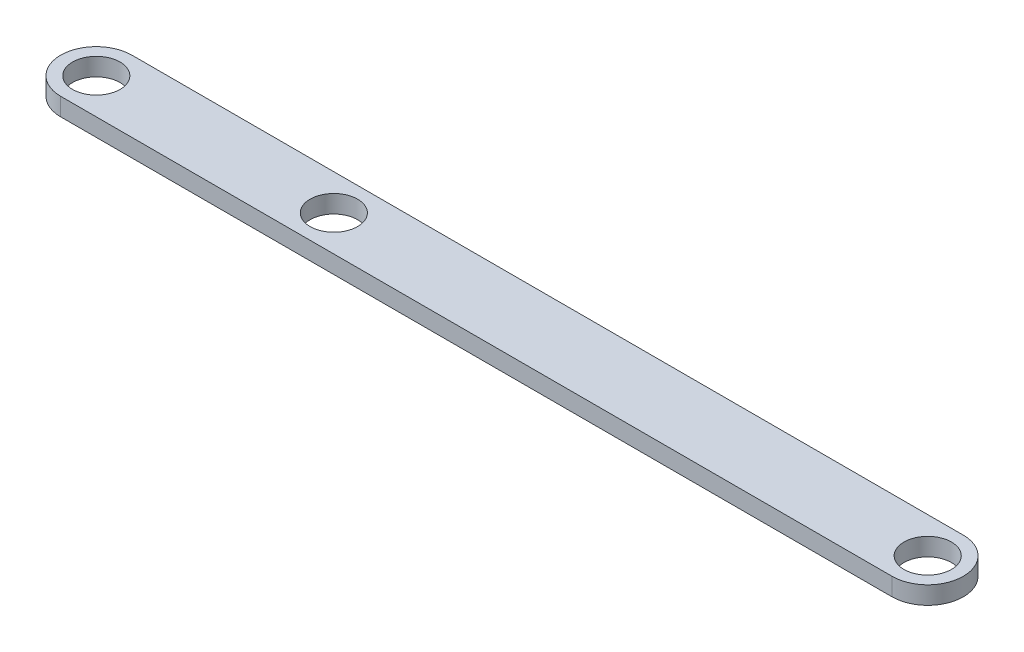
ISO-10303-21;
HEADER;
FILE_DESCRIPTION(('STEP AP214'),'2;1');
FILE_NAME('part.step','',(''),(''),'','','');
FILE_SCHEMA(('AUTOMOTIVE_DESIGN { 1 0 10303 214 1 1 1 1 }'));
ENDSEC;
DATA;
#1=APPLICATION_CONTEXT('core data for automotive mechanical design processes');
#2=APPLICATION_PROTOCOL_DEFINITION('international standard','automotive_design',2000,#1);
#3=PRODUCT_CONTEXT('',#1,'mechanical');
#4=PRODUCT('Part','Part','',(#3));
#5=PRODUCT_RELATED_PRODUCT_CATEGORY('part','',(#4));
#6=PRODUCT_DEFINITION_FORMATION('','',#4);
#7=PRODUCT_DEFINITION_CONTEXT('part definition',#1,'design');
#8=PRODUCT_DEFINITION('design','',#6,#7);
#9=PRODUCT_DEFINITION_SHAPE('','',#8);
#10=(LENGTH_UNIT() NAMED_UNIT(*) SI_UNIT(.MILLI.,.METRE.));
#11=(NAMED_UNIT(*) PLANE_ANGLE_UNIT() SI_UNIT($,.RADIAN.));
#12=(NAMED_UNIT(*) SI_UNIT($,.STERADIAN.) SOLID_ANGLE_UNIT());
#13=UNCERTAINTY_MEASURE_WITH_UNIT(LENGTH_MEASURE(1.E-05),#10,'distance_accuracy_value','');
#14=(GEOMETRIC_REPRESENTATION_CONTEXT(3) GLOBAL_UNCERTAINTY_ASSIGNED_CONTEXT((#13)) GLOBAL_UNIT_ASSIGNED_CONTEXT((#10,
#11,#12)) REPRESENTATION_CONTEXT('',''));
#15=CARTESIAN_POINT('',(0.,0.,0.));
#16=DIRECTION('',(0.,0.,1.));
#17=DIRECTION('',(1.,0.,0.));
#18=AXIS2_PLACEMENT_3D('',#15,#16,#17);
#19=CARTESIAN_POINT('',(0.,3.,0.));
#20=DIRECTION('',(0.,1.,0.));
#21=DIRECTION('',(0.,0.,1.));
#22=AXIS2_PLACEMENT_3D('',#19,#20,#21);
#23=PLANE('',#22);
#24=CARTESIAN_POINT('',(40.,3.,0.));
#25=DIRECTION('',(0.,1.,0.));
#26=DIRECTION('',(0.,0.,1.));
#27=AXIS2_PLACEMENT_3D('',#24,#25,#26);
#28=CIRCLE('',#27,4.);
#29=CARTESIAN_POINT('',(40.,3.,4.));
#30=VERTEX_POINT('',#29);
#31=EDGE_CURVE('E128',#30,#30,#28,.T.);
#32=ORIENTED_EDGE('',*,*,#31,.F.);
#33=EDGE_LOOP('',(#32));
#34=FACE_BOUND('',#33,.T.);
#35=CARTESIAN_POINT('',(0.,3.,0.));
#36=DIRECTION('',(0.,1.,0.));
#37=DIRECTION('',(0.,0.,1.));
#38=AXIS2_PLACEMENT_3D('',#35,#36,#37);
#39=CIRCLE('',#38,4.);
#40=CARTESIAN_POINT('',(0.,3.,4.));
#41=VERTEX_POINT('',#40);
#42=EDGE_CURVE('E104',#41,#41,#39,.T.);
#43=ORIENTED_EDGE('',*,*,#42,.F.);
#44=EDGE_LOOP('',(#43));
#45=FACE_BOUND('',#44,.T.);
#46=CARTESIAN_POINT('',(0.,3.,0.));
#47=DIRECTION('',(0.,1.,0.));
#48=DIRECTION('',(0.,0.,1.));
#49=AXIS2_PLACEMENT_3D('',#46,#47,#48);
#50=CIRCLE('',#49,6.);
#51=CARTESIAN_POINT('',(0.,3.,-6.));
#52=VERTEX_POINT('',#51);
#53=CARTESIAN_POINT('',(0.,3.,6.));
#54=VERTEX_POINT('',#53);
#55=EDGE_CURVE('E89',#52,#54,#50,.T.);
#56=ORIENTED_EDGE('',*,*,#55,.T.);
#57=DIRECTION('',(1.,0.,0.));
#58=VECTOR('',#57,1.);
#59=CARTESIAN_POINT('',(0.,3.,6.));
#60=LINE('',#59,#58);
#61=CARTESIAN_POINT('',(140.,3.,6.));
#62=VERTEX_POINT('',#61);
#63=EDGE_CURVE('E84',#54,#62,#60,.T.);
#64=ORIENTED_EDGE('',*,*,#63,.T.);
#65=CARTESIAN_POINT('',(140.,3.,0.));
#66=DIRECTION('',(0.,1.,0.));
#67=DIRECTION('',(0.,0.,1.));
#68=AXIS2_PLACEMENT_3D('',#65,#66,#67);
#69=CIRCLE('',#68,6.);
#70=CARTESIAN_POINT('',(140.,3.,-6.));
#71=VERTEX_POINT('',#70);
#72=EDGE_CURVE('E87',#62,#71,#69,.T.);
#73=ORIENTED_EDGE('',*,*,#72,.T.);
#74=DIRECTION('',(-1.,0.,0.));
#75=VECTOR('',#74,1.);
#76=CARTESIAN_POINT('',(0.,3.,-6.));
#77=LINE('',#76,#75);
#78=EDGE_CURVE('E54',#71,#52,#77,.T.);
#79=ORIENTED_EDGE('',*,*,#78,.T.);
#80=EDGE_LOOP('',(#56,#64,#73,#79));
#81=FACE_BOUND('',#80,.T.);
#82=CARTESIAN_POINT('',(140.,3.,0.));
#83=DIRECTION('',(0.,1.,0.));
#84=DIRECTION('',(0.,0.,1.));
#85=AXIS2_PLACEMENT_3D('',#82,#83,#84);
#86=CIRCLE('',#85,3.99999999999999);
#87=CARTESIAN_POINT('',(140.,3.,3.99999999999999));
#88=VERTEX_POINT('',#87);
#89=EDGE_CURVE('E119',#88,#88,#86,.T.);
#90=ORIENTED_EDGE('',*,*,#89,.F.);
#91=EDGE_LOOP('',(#90));
#92=FACE_BOUND('',#91,.T.);
#93=ADVANCED_FACE('F37',(#34,#45,#81,#92),#23,.T.);
#94=CARTESIAN_POINT('',(0.,0.,0.));
#95=DIRECTION('',(0.,1.,0.));
#96=DIRECTION('',(0.,0.,1.));
#97=AXIS2_PLACEMENT_3D('',#94,#95,#96);
#98=PLANE('',#97);
#99=CARTESIAN_POINT('',(40.,0.,0.));
#100=DIRECTION('',(0.,1.,0.));
#101=DIRECTION('',(0.,0.,1.));
#102=AXIS2_PLACEMENT_3D('',#99,#100,#101);
#103=CIRCLE('',#102,4.);
#104=CARTESIAN_POINT('',(40.,0.,4.));
#105=VERTEX_POINT('',#104);
#106=EDGE_CURVE('E125',#105,#105,#103,.T.);
#107=ORIENTED_EDGE('',*,*,#106,.T.);
#108=EDGE_LOOP('',(#107));
#109=FACE_BOUND('',#108,.T.);
#110=CARTESIAN_POINT('',(0.,0.,0.));
#111=DIRECTION('',(0.,1.,0.));
#112=DIRECTION('',(0.,0.,1.));
#113=AXIS2_PLACEMENT_3D('',#110,#111,#112);
#114=CIRCLE('',#113,6.);
#115=CARTESIAN_POINT('',(0.,0.,-6.));
#116=VERTEX_POINT('',#115);
#117=CARTESIAN_POINT('',(0.,0.,6.));
#118=VERTEX_POINT('',#117);
#119=EDGE_CURVE('E101',#116,#118,#114,.T.);
#120=ORIENTED_EDGE('',*,*,#119,.F.);
#121=DIRECTION('',(-1.,0.,0.));
#122=VECTOR('',#121,1.);
#123=CARTESIAN_POINT('',(0.,0.,-6.));
#124=LINE('',#123,#122);
#125=CARTESIAN_POINT('',(140.,0.,-6.));
#126=VERTEX_POINT('',#125);
#127=EDGE_CURVE('E77',#126,#116,#124,.T.);
#128=ORIENTED_EDGE('',*,*,#127,.F.);
#129=CARTESIAN_POINT('',(140.,0.,0.));
#130=DIRECTION('',(0.,1.,0.));
#131=DIRECTION('',(0.,0.,1.));
#132=AXIS2_PLACEMENT_3D('',#129,#130,#131);
#133=CIRCLE('',#132,6.);
#134=CARTESIAN_POINT('',(140.,0.,6.));
#135=VERTEX_POINT('',#134);
#136=EDGE_CURVE('E71',#135,#126,#133,.T.);
#137=ORIENTED_EDGE('',*,*,#136,.F.);
#138=DIRECTION('',(1.,0.,0.));
#139=VECTOR('',#138,1.);
#140=CARTESIAN_POINT('',(0.,0.,6.));
#141=LINE('',#140,#139);
#142=EDGE_CURVE('E93',#118,#135,#141,.T.);
#143=ORIENTED_EDGE('',*,*,#142,.F.);
#144=EDGE_LOOP('',(#120,#128,#137,#143));
#145=FACE_BOUND('',#144,.T.);
#146=CARTESIAN_POINT('',(0.,0.,0.));
#147=DIRECTION('',(0.,1.,0.));
#148=DIRECTION('',(0.,0.,1.));
#149=AXIS2_PLACEMENT_3D('',#146,#147,#148);
#150=CIRCLE('',#149,4.);
#151=CARTESIAN_POINT('',(0.,0.,4.));
#152=VERTEX_POINT('',#151);
#153=EDGE_CURVE('E116',#152,#152,#150,.T.);
#154=ORIENTED_EDGE('',*,*,#153,.T.);
#155=EDGE_LOOP('',(#154));
#156=FACE_BOUND('',#155,.T.);
#157=CARTESIAN_POINT('',(140.,0.,0.));
#158=DIRECTION('',(0.,1.,0.));
#159=DIRECTION('',(0.,0.,1.));
#160=AXIS2_PLACEMENT_3D('',#157,#158,#159);
#161=CIRCLE('',#160,3.99999999999999);
#162=CARTESIAN_POINT('',(140.,0.,3.99999999999999));
#163=VERTEX_POINT('',#162);
#164=EDGE_CURVE('E122',#163,#163,#161,.T.);
#165=ORIENTED_EDGE('',*,*,#164,.T.);
#166=EDGE_LOOP('',(#165));
#167=FACE_BOUND('',#166,.T.);
#168=ADVANCED_FACE('F112',(#109,#145,#156,#167),#98,.F.);
#169=CARTESIAN_POINT('',(0.,3.,0.));
#170=DIRECTION('',(0.,-1.,0.));
#171=DIRECTION('',(0.,0.,-1.));
#172=AXIS2_PLACEMENT_3D('',#169,#170,#171);
#173=CYLINDRICAL_SURFACE('',#172,6.);
#174=ORIENTED_EDGE('',*,*,#119,.T.);
#175=DIRECTION('',(0.,-1.,0.));
#176=VECTOR('',#175,1.);
#177=CARTESIAN_POINT('',(0.,3.,6.));
#178=LINE('',#177,#176);
#179=EDGE_CURVE('E11',#54,#118,#178,.T.);
#180=ORIENTED_EDGE('',*,*,#179,.F.);
#181=ORIENTED_EDGE('',*,*,#55,.F.);
#182=DIRECTION('',(0.,-1.,0.));
#183=VECTOR('',#182,1.);
#184=CARTESIAN_POINT('',(0.,3.,-6.));
#185=LINE('',#184,#183);
#186=EDGE_CURVE('E97',#52,#116,#185,.T.);
#187=ORIENTED_EDGE('',*,*,#186,.T.);
#188=EDGE_LOOP('',(#174,#180,#181,#187));
#189=FACE_BOUND('',#188,.T.);
#190=ADVANCED_FACE('F39',(#189),#173,.T.);
#191=CARTESIAN_POINT('',(0.,3.,6.));
#192=DIRECTION('',(0.,0.,-1.));
#193=DIRECTION('',(-1.,0.,0.));
#194=AXIS2_PLACEMENT_3D('',#191,#192,#193);
#195=PLANE('',#194);
#196=ORIENTED_EDGE('',*,*,#142,.T.);
#197=DIRECTION('',(0.,-1.,0.));
#198=VECTOR('',#197,1.);
#199=CARTESIAN_POINT('',(140.,3.,6.));
#200=LINE('',#199,#198);
#201=EDGE_CURVE('E46',#62,#135,#200,.T.);
#202=ORIENTED_EDGE('',*,*,#201,.F.);
#203=ORIENTED_EDGE('',*,*,#63,.F.);
#204=ORIENTED_EDGE('',*,*,#179,.T.);
#205=EDGE_LOOP('',(#196,#202,#203,#204));
#206=FACE_BOUND('',#205,.T.);
#207=ADVANCED_FACE('F92',(#206),#195,.F.);
#208=CARTESIAN_POINT('',(140.,3.,0.));
#209=DIRECTION('',(0.,-1.,0.));
#210=DIRECTION('',(0.,0.,-1.));
#211=AXIS2_PLACEMENT_3D('',#208,#209,#210);
#212=CYLINDRICAL_SURFACE('',#211,6.);
#213=ORIENTED_EDGE('',*,*,#136,.T.);
#214=DIRECTION('',(0.,-1.,0.));
#215=VECTOR('',#214,1.);
#216=CARTESIAN_POINT('',(140.,3.,-6.));
#217=LINE('',#216,#215);
#218=EDGE_CURVE('E94',#71,#126,#217,.T.);
#219=ORIENTED_EDGE('',*,*,#218,.F.);
#220=ORIENTED_EDGE('',*,*,#72,.F.);
#221=ORIENTED_EDGE('',*,*,#201,.T.);
#222=EDGE_LOOP('',(#213,#219,#220,#221));
#223=FACE_BOUND('',#222,.T.);
#224=ADVANCED_FACE('F95',(#223),#212,.T.);
#225=CARTESIAN_POINT('',(0.,3.,-6.));
#226=DIRECTION('',(0.,0.,1.));
#227=DIRECTION('',(1.,0.,0.));
#228=AXIS2_PLACEMENT_3D('',#225,#226,#227);
#229=PLANE('',#228);
#230=ORIENTED_EDGE('',*,*,#127,.T.);
#231=ORIENTED_EDGE('',*,*,#186,.F.);
#232=ORIENTED_EDGE('',*,*,#78,.F.);
#233=ORIENTED_EDGE('',*,*,#218,.T.);
#234=EDGE_LOOP('',(#230,#231,#232,#233));
#235=FACE_BOUND('',#234,.T.);
#236=ADVANCED_FACE('F109',(#235),#229,.F.);
#237=CARTESIAN_POINT('',(0.,3.,0.));
#238=DIRECTION('',(0.,-1.,0.));
#239=DIRECTION('',(0.,0.,-1.));
#240=AXIS2_PLACEMENT_3D('',#237,#238,#239);
#241=CYLINDRICAL_SURFACE('',#240,4.);
#242=ORIENTED_EDGE('',*,*,#42,.T.);
#243=EDGE_LOOP('',(#242));
#244=FACE_BOUND('',#243,.T.);
#245=ORIENTED_EDGE('',*,*,#153,.F.);
#246=EDGE_LOOP('',(#245));
#247=FACE_BOUND('',#246,.T.);
#248=ADVANCED_FACE('F147',(#244,#247),#241,.F.);
#249=CARTESIAN_POINT('',(140.,3.,0.));
#250=DIRECTION('',(0.,-1.,0.));
#251=DIRECTION('',(0.,0.,-1.));
#252=AXIS2_PLACEMENT_3D('',#249,#250,#251);
#253=CYLINDRICAL_SURFACE('',#252,3.99999999999999);
#254=ORIENTED_EDGE('',*,*,#89,.T.);
#255=EDGE_LOOP('',(#254));
#256=FACE_BOUND('',#255,.T.);
#257=ORIENTED_EDGE('',*,*,#164,.F.);
#258=EDGE_LOOP('',(#257));
#259=FACE_BOUND('',#258,.T.);
#260=ADVANCED_FACE('F138',(#256,#259),#253,.F.);
#261=CARTESIAN_POINT('',(40.,0.,0.));
#262=DIRECTION('',(0.,1.,0.));
#263=DIRECTION('',(0.,0.,1.));
#264=AXIS2_PLACEMENT_3D('',#261,#262,#263);
#265=CYLINDRICAL_SURFACE('',#264,4.);
#266=ORIENTED_EDGE('',*,*,#106,.F.);
#267=EDGE_LOOP('',(#266));
#268=FACE_BOUND('',#267,.T.);
#269=ORIENTED_EDGE('',*,*,#31,.T.);
#270=EDGE_LOOP('',(#269));
#271=FACE_BOUND('',#270,.T.);
#272=ADVANCED_FACE('F135',(#268,#271),#265,.F.);
#273=CLOSED_SHELL('',(#93,#168,#190,#207,#224,#236,#248,#260,#272));
#274=MANIFOLD_SOLID_BREP('B2',#273);
#275=ADVANCED_BREP_SHAPE_REPRESENTATION('',(#18,#274),#14);
#276=SHAPE_DEFINITION_REPRESENTATION(#9,#275);
ENDSEC;
END-ISO-10303-21;
